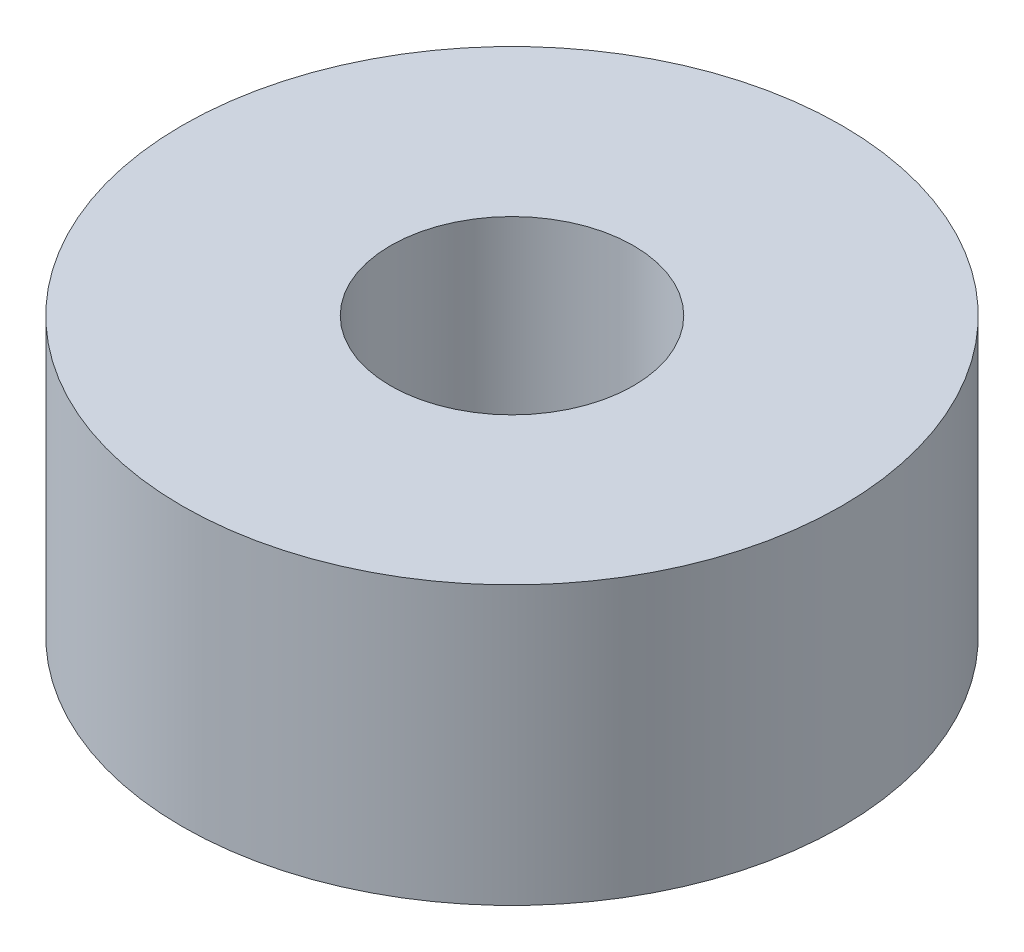
ISO-10303-21;
HEADER;
FILE_DESCRIPTION(('STEP AP214'),'2;1');
FILE_NAME('part.step','',(''),(''),'','','');
FILE_SCHEMA(('AUTOMOTIVE_DESIGN { 1 0 10303 214 1 1 1 1 }'));
ENDSEC;
DATA;
#1=APPLICATION_CONTEXT('core data for automotive mechanical design processes');
#2=APPLICATION_PROTOCOL_DEFINITION('international standard','automotive_design',2000,#1);
#3=PRODUCT_CONTEXT('',#1,'mechanical');
#4=PRODUCT('Part','Part','',(#3));
#5=PRODUCT_RELATED_PRODUCT_CATEGORY('part','',(#4));
#6=PRODUCT_DEFINITION_FORMATION('','',#4);
#7=PRODUCT_DEFINITION_CONTEXT('part definition',#1,'design');
#8=PRODUCT_DEFINITION('design','',#6,#7);
#9=PRODUCT_DEFINITION_SHAPE('','',#8);
#10=(LENGTH_UNIT() NAMED_UNIT(*) SI_UNIT(.MILLI.,.METRE.));
#11=(NAMED_UNIT(*) PLANE_ANGLE_UNIT() SI_UNIT($,.RADIAN.));
#12=(NAMED_UNIT(*) SI_UNIT($,.STERADIAN.) SOLID_ANGLE_UNIT());
#13=UNCERTAINTY_MEASURE_WITH_UNIT(LENGTH_MEASURE(1.E-05),#10,'distance_accuracy_value','');
#14=(GEOMETRIC_REPRESENTATION_CONTEXT(3) GLOBAL_UNCERTAINTY_ASSIGNED_CONTEXT((#13)) GLOBAL_UNIT_ASSIGNED_CONTEXT((#10,
#11,#12)) REPRESENTATION_CONTEXT('',''));
#15=CARTESIAN_POINT('',(0.,0.,0.));
#16=DIRECTION('',(0.,0.,1.));
#17=DIRECTION('',(1.,0.,0.));
#18=AXIS2_PLACEMENT_3D('',#15,#16,#17);
#19=CARTESIAN_POINT('',(0.,4.,0.));
#20=DIRECTION('',(0.,-1.,0.));
#21=DIRECTION('',(0.,0.,-1.));
#22=AXIS2_PLACEMENT_3D('',#19,#20,#21);
#23=CYLINDRICAL_SURFACE('',#22,4.75);
#24=CARTESIAN_POINT('',(0.,4.,0.));
#25=DIRECTION('',(0.,1.,0.));
#26=DIRECTION('',(0.,0.,1.));
#27=AXIS2_PLACEMENT_3D('',#24,#25,#26);
#28=CIRCLE('',#27,4.75);
#29=CARTESIAN_POINT('',(0.,4.,4.75));
#30=VERTEX_POINT('',#29);
#31=EDGE_CURVE('E10',#30,#30,#28,.T.);
#32=ORIENTED_EDGE('',*,*,#31,.F.);
#33=EDGE_LOOP('',(#32));
#34=FACE_BOUND('',#33,.T.);
#35=CARTESIAN_POINT('',(0.,0.,0.));
#36=DIRECTION('',(0.,1.,0.));
#37=DIRECTION('',(0.,0.,1.));
#38=AXIS2_PLACEMENT_3D('',#35,#36,#37);
#39=CIRCLE('',#38,4.75);
#40=CARTESIAN_POINT('',(0.,0.,4.75));
#41=VERTEX_POINT('',#40);
#42=EDGE_CURVE('E33',#41,#41,#39,.T.);
#43=ORIENTED_EDGE('',*,*,#42,.T.);
#44=EDGE_LOOP('',(#43));
#45=FACE_BOUND('',#44,.T.);
#46=ADVANCED_FACE('F30',(#34,#45),#23,.T.);
#47=CARTESIAN_POINT('',(0.,4.,0.));
#48=DIRECTION('',(0.,1.,0.));
#49=DIRECTION('',(0.,0.,1.));
#50=AXIS2_PLACEMENT_3D('',#47,#48,#49);
#51=PLANE('',#50);
#52=CARTESIAN_POINT('',(0.,4.,0.));
#53=DIRECTION('',(0.,1.,0.));
#54=DIRECTION('',(0.,0.,1.));
#55=AXIS2_PLACEMENT_3D('',#52,#53,#54);
#56=CIRCLE('',#55,1.75);
#57=CARTESIAN_POINT('',(0.,4.,1.75));
#58=VERTEX_POINT('',#57);
#59=EDGE_CURVE('E42',#58,#58,#56,.T.);
#60=ORIENTED_EDGE('',*,*,#59,.F.);
#61=EDGE_LOOP('',(#60));
#62=FACE_BOUND('',#61,.T.);
#63=ORIENTED_EDGE('',*,*,#31,.T.);
#64=EDGE_LOOP('',(#63));
#65=FACE_BOUND('',#64,.T.);
#66=ADVANCED_FACE('F57',(#62,#65),#51,.T.);
#67=CARTESIAN_POINT('',(0.,0.,0.));
#68=DIRECTION('',(0.,1.,0.));
#69=DIRECTION('',(0.,0.,1.));
#70=AXIS2_PLACEMENT_3D('',#67,#68,#69);
#71=PLANE('',#70);
#72=CARTESIAN_POINT('',(0.,0.,0.));
#73=DIRECTION('',(0.,1.,0.));
#74=DIRECTION('',(0.,0.,1.));
#75=AXIS2_PLACEMENT_3D('',#72,#73,#74);
#76=CIRCLE('',#75,1.75);
#77=CARTESIAN_POINT('',(0.,0.,1.75));
#78=VERTEX_POINT('',#77);
#79=EDGE_CURVE('E40',#78,#78,#76,.T.);
#80=ORIENTED_EDGE('',*,*,#79,.T.);
#81=EDGE_LOOP('',(#80));
#82=FACE_BOUND('',#81,.T.);
#83=ORIENTED_EDGE('',*,*,#42,.F.);
#84=EDGE_LOOP('',(#83));
#85=FACE_BOUND('',#84,.T.);
#86=ADVANCED_FACE('F48',(#82,#85),#71,.F.);
#87=CARTESIAN_POINT('',(0.,0.,0.));
#88=DIRECTION('',(0.,1.,0.));
#89=DIRECTION('',(0.,0.,1.));
#90=AXIS2_PLACEMENT_3D('',#87,#88,#89);
#91=CYLINDRICAL_SURFACE('',#90,1.75);
#92=ORIENTED_EDGE('',*,*,#79,.F.);
#93=EDGE_LOOP('',(#92));
#94=FACE_BOUND('',#93,.T.);
#95=ORIENTED_EDGE('',*,*,#59,.T.);
#96=EDGE_LOOP('',(#95));
#97=FACE_BOUND('',#96,.T.);
#98=ADVANCED_FACE('F51',(#94,#97),#91,.F.);
#99=CLOSED_SHELL('',(#46,#66,#86,#98));
#100=MANIFOLD_SOLID_BREP('B2',#99);
#101=ADVANCED_BREP_SHAPE_REPRESENTATION('',(#18,#100),#14);
#102=SHAPE_DEFINITION_REPRESENTATION(#9,#101);
ENDSEC;
END-ISO-10303-21;
